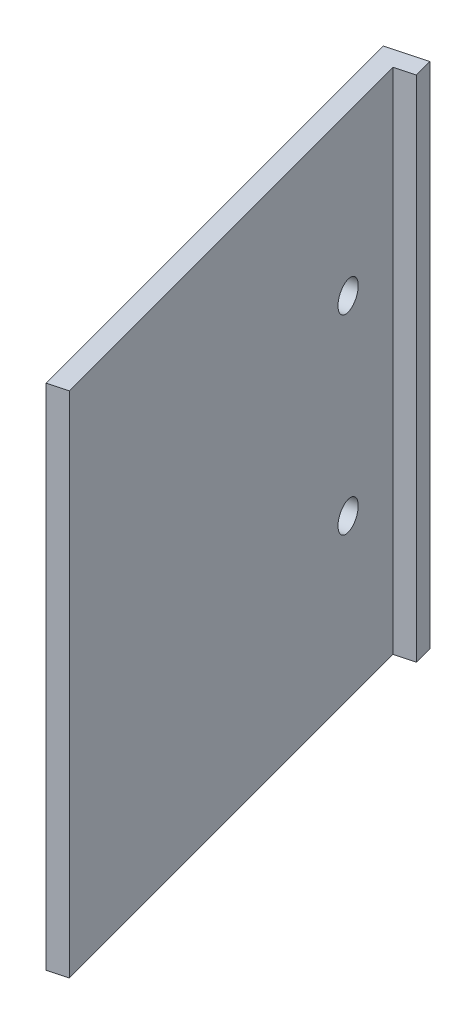
ISO-10303-21;
HEADER;
FILE_DESCRIPTION(('STEP AP214'),'2;1');
FILE_NAME('part.step','',(''),(''),'','','');
FILE_SCHEMA(('AUTOMOTIVE_DESIGN { 1 0 10303 214 1 1 1 1 }'));
ENDSEC;
DATA;
#1=APPLICATION_CONTEXT('core data for automotive mechanical design processes');
#2=APPLICATION_PROTOCOL_DEFINITION('international standard','automotive_design',2000,#1);
#3=PRODUCT_CONTEXT('',#1,'mechanical');
#4=PRODUCT('Part','Part','',(#3));
#5=PRODUCT_RELATED_PRODUCT_CATEGORY('part','',(#4));
#6=PRODUCT_DEFINITION_FORMATION('','',#4);
#7=PRODUCT_DEFINITION_CONTEXT('part definition',#1,'design');
#8=PRODUCT_DEFINITION('design','',#6,#7);
#9=PRODUCT_DEFINITION_SHAPE('','',#8);
#10=(LENGTH_UNIT() NAMED_UNIT(*) SI_UNIT(.MILLI.,.METRE.));
#11=(NAMED_UNIT(*) PLANE_ANGLE_UNIT() SI_UNIT($,.RADIAN.));
#12=(NAMED_UNIT(*) SI_UNIT($,.STERADIAN.) SOLID_ANGLE_UNIT());
#13=UNCERTAINTY_MEASURE_WITH_UNIT(LENGTH_MEASURE(1.E-05),#10,'distance_accuracy_value','');
#14=(GEOMETRIC_REPRESENTATION_CONTEXT(3) GLOBAL_UNCERTAINTY_ASSIGNED_CONTEXT((#13)) GLOBAL_UNIT_ASSIGNED_CONTEXT((#10,
#11,#12)) REPRESENTATION_CONTEXT('',''));
#15=CARTESIAN_POINT('',(0.,0.,0.));
#16=DIRECTION('',(0.,0.,1.));
#17=DIRECTION('',(1.,0.,0.));
#18=AXIS2_PLACEMENT_3D('',#15,#16,#17);
#19=CARTESIAN_POINT('',(-1043.099059252,1824.,2822.933131666));
#20=DIRECTION('',(-0.965925826288944,0.,0.258819045102985));
#21=DIRECTION('',(0.,1.,0.));
#22=AXIS2_PLACEMENT_3D('',#19,#20,#21);
#23=CYLINDRICAL_SURFACE('',#22,4.5);
#24=CARTESIAN_POINT('',(-1043.00246667,1824.,2822.907249761));
#25=DIRECTION('',(-0.965925826288944,0.,0.258819045102985));
#26=DIRECTION('',(0.,1.,0.));
#27=AXIS2_PLACEMENT_3D('',#24,#25,#26);
#28=CIRCLE('',#27,4.5);
#29=CARTESIAN_POINT('',(-1043.00246667,1828.5,2822.907249761));
#30=VERTEX_POINT('',#29);
#31=EDGE_CURVE('E130',#30,#30,#28,.T.);
#32=ORIENTED_EDGE('',*,*,#31,.T.);
#33=DIRECTION('',(0.965925826288944,0.,-0.258819045102985));
#34=VECTOR('',#33,1.);
#35=CARTESIAN_POINT('',(-1043.099059252,1828.5,2822.933131666));
#36=LINE('',#35,#34);
#37=CARTESIAN_POINT('',(-1037.206911712,1828.5,2821.354335491));
#38=VERTEX_POINT('',#37);
#39=EDGE_CURVE('E11',#30,#38,#36,.T.);
#40=ORIENTED_EDGE('',*,*,#39,.T.);
#41=CARTESIAN_POINT('',(-1037.206911712,1824.,2821.354335491));
#42=DIRECTION('',(-0.965925826288944,0.,0.258819045102985));
#43=DIRECTION('',(0.,1.,0.));
#44=AXIS2_PLACEMENT_3D('',#41,#42,#43);
#45=CIRCLE('',#44,4.5);
#46=EDGE_CURVE('E144',#38,#38,#45,.T.);
#47=ORIENTED_EDGE('',*,*,#46,.F.);
#48=ORIENTED_EDGE('',*,*,#39,.F.);
#49=EDGE_LOOP('',(#32,#40,#47,#48));
#50=FACE_BOUND('',#49,.T.);
#51=ADVANCED_FACE('F17',(#50),#23,.F.);
#52=CARTESIAN_POINT('',(-1043.099059252,1764.,2822.933131666));
#53=DIRECTION('',(-0.965925826288944,0.,0.258819045102985));
#54=DIRECTION('',(0.,1.,0.));
#55=AXIS2_PLACEMENT_3D('',#52,#53,#54);
#56=CYLINDRICAL_SURFACE('',#55,4.5);
#57=CARTESIAN_POINT('',(-1043.00246667,1764.,2822.907249761));
#58=DIRECTION('',(-0.965925826288944,0.,0.258819045102985));
#59=DIRECTION('',(0.,1.,0.));
#60=AXIS2_PLACEMENT_3D('',#57,#58,#59);
#61=CIRCLE('',#60,4.5);
#62=CARTESIAN_POINT('',(-1043.00246667,1768.5,2822.907249761));
#63=VERTEX_POINT('',#62);
#64=EDGE_CURVE('E102',#63,#63,#61,.T.);
#65=ORIENTED_EDGE('',*,*,#64,.T.);
#66=DIRECTION('',(0.965925826288944,0.,-0.258819045102985));
#67=VECTOR('',#66,1.);
#68=CARTESIAN_POINT('',(-1043.099059252,1768.5,2822.933131666));
#69=LINE('',#68,#67);
#70=CARTESIAN_POINT('',(-1037.206911712,1768.5,2821.354335491));
#71=VERTEX_POINT('',#70);
#72=EDGE_CURVE('E26',#63,#71,#69,.T.);
#73=ORIENTED_EDGE('',*,*,#72,.T.);
#74=CARTESIAN_POINT('',(-1037.206911712,1764.,2821.354335491));
#75=DIRECTION('',(-0.965925826288944,0.,0.258819045102985));
#76=DIRECTION('',(0.,1.,0.));
#77=AXIS2_PLACEMENT_3D('',#74,#75,#76);
#78=CIRCLE('',#77,4.5);
#79=EDGE_CURVE('E138',#71,#71,#78,.T.);
#80=ORIENTED_EDGE('',*,*,#79,.F.);
#81=ORIENTED_EDGE('',*,*,#72,.F.);
#82=EDGE_LOOP('',(#65,#73,#80,#81));
#83=FACE_BOUND('',#82,.T.);
#84=ADVANCED_FACE('F19',(#83),#56,.F.);
#85=CARTESIAN_POINT('',(-1043.936206885,1874.,2796.240264007));
#86=DIRECTION('',(0.,1.,0.));
#87=DIRECTION('',(1.,0.,0.));
#88=AXIS2_PLACEMENT_3D('',#85,#86,#87);
#89=PLANE('',#88);
#90=DIRECTION('',(0.258819045102985,0.,0.965925826288944));
#91=VECTOR('',#90,1.);
#92=CARTESIAN_POINT('',(-1043.936206885,1874.,2796.240264007));
#93=LINE('',#92,#91);
#94=CARTESIAN_POINT('',(-1042.383292614,1874.,2802.035818965));
#95=VERTEX_POINT('',#94);
#96=CARTESIAN_POINT('',(-1005.113350119,1874.,2941.12913795));
#97=VERTEX_POINT('',#96);
#98=EDGE_CURVE('E181',#95,#97,#93,.T.);
#99=ORIENTED_EDGE('',*,*,#98,.F.);
#100=DIRECTION('',(-0.965925826288944,0.,0.258819045102985));
#101=VECTOR('',#100,1.);
#102=CARTESIAN_POINT('',(-1036.587737656,1874.,2800.482904694));
#103=LINE('',#102,#101);
#104=CARTESIAN_POINT('',(-1036.587737656,1874.,2800.482904694));
#105=VERTEX_POINT('',#104);
#106=EDGE_CURVE('E158',#105,#95,#103,.T.);
#107=ORIENTED_EDGE('',*,*,#106,.F.);
#108=DIRECTION('',(0.258819045102985,0.,0.965925826288944));
#109=VECTOR('',#108,1.);
#110=CARTESIAN_POINT('',(-1038.140651927,1874.,2794.687349737));
#111=LINE('',#110,#109);
#112=CARTESIAN_POINT('',(-1038.140651927,1874.,2794.687349737));
#113=VERTEX_POINT('',#112);
#114=EDGE_CURVE('E109',#113,#105,#111,.T.);
#115=ORIENTED_EDGE('',*,*,#114,.F.);
#116=DIRECTION('',(0.965925826288944,0.,-0.258819045102985));
#117=VECTOR('',#116,1.);
#118=CARTESIAN_POINT('',(-1049.731761842,1874.,2797.793178278));
#119=LINE('',#118,#117);
#120=CARTESIAN_POINT('',(-1049.731761842,1874.,2797.793178278));
#121=VERTEX_POINT('',#120);
#122=EDGE_CURVE('E105',#121,#113,#119,.T.);
#123=ORIENTED_EDGE('',*,*,#122,.F.);
#124=DIRECTION('',(0.258819045102985,0.,0.965925826288944));
#125=VECTOR('',#124,1.);
#126=CARTESIAN_POINT('',(-1049.731761842,1874.,2797.793178278));
#127=LINE('',#126,#125);
#128=CARTESIAN_POINT('',(-1010.908905077,1874.,2942.682052221));
#129=VERTEX_POINT('',#128);
#130=EDGE_CURVE('E91',#121,#129,#127,.T.);
#131=ORIENTED_EDGE('',*,*,#130,.T.);
#132=DIRECTION('',(-0.965925826288944,0.,0.258819045102985));
#133=VECTOR('',#132,1.);
#134=CARTESIAN_POINT('',(-1005.113350119,1874.,2941.12913795));
#135=LINE('',#134,#133);
#136=EDGE_CURVE('E133',#97,#129,#135,.T.);
#137=ORIENTED_EDGE('',*,*,#136,.F.);
#138=EDGE_LOOP('',(#99,#107,#115,#123,#131,#137));
#139=FACE_BOUND('',#138,.T.);
#140=ADVANCED_FACE('F107',(#139),#89,.T.);
#141=CARTESIAN_POINT('',(-1005.113350119,1714.,2941.12913795));
#142=DIRECTION('',(0.258819045102985,0.,0.965925826288944));
#143=DIRECTION('',(0.,-1.,0.));
#144=AXIS2_PLACEMENT_3D('',#141,#142,#143);
#145=PLANE('',#144);
#146=DIRECTION('',(-0.965925826288944,0.,0.258819045102985));
#147=VECTOR('',#146,1.);
#148=CARTESIAN_POINT('',(-1005.113350119,1714.,2941.12913795));
#149=LINE('',#148,#147);
#150=CARTESIAN_POINT('',(-1005.113350119,1714.,2941.12913795));
#151=VERTEX_POINT('',#150);
#152=CARTESIAN_POINT('',(-1010.908905077,1714.,2942.682052221));
#153=VERTEX_POINT('',#152);
#154=EDGE_CURVE('E174',#151,#153,#149,.T.);
#155=ORIENTED_EDGE('',*,*,#154,.F.);
#156=DIRECTION('',(0.,1.,0.));
#157=VECTOR('',#156,1.);
#158=CARTESIAN_POINT('',(-1005.113350119,1714.,2941.12913795));
#159=LINE('',#158,#157);
#160=EDGE_CURVE('E155',#151,#97,#159,.T.);
#161=ORIENTED_EDGE('',*,*,#160,.T.);
#162=ORIENTED_EDGE('',*,*,#136,.T.);
#163=DIRECTION('',(0.,1.,0.));
#164=VECTOR('',#163,1.);
#165=CARTESIAN_POINT('',(-1010.908905077,1714.,2942.682052221));
#166=LINE('',#165,#164);
#167=EDGE_CURVE('E99',#153,#129,#166,.T.);
#168=ORIENTED_EDGE('',*,*,#167,.F.);
#169=EDGE_LOOP('',(#155,#161,#162,#168));
#170=FACE_BOUND('',#169,.T.);
#171=ADVANCED_FACE('F213',(#170),#145,.T.);
#172=CARTESIAN_POINT('',(-1049.731761842,1714.,2797.793178278));
#173=DIRECTION('',(-0.965925826288944,0.,0.258819045102985));
#174=DIRECTION('',(0.,1.,0.));
#175=AXIS2_PLACEMENT_3D('',#172,#173,#174);
#176=PLANE('',#175);
#177=ORIENTED_EDGE('',*,*,#31,.F.);
#178=EDGE_LOOP('',(#177));
#179=FACE_BOUND('',#178,.T.);
#180=ORIENTED_EDGE('',*,*,#64,.F.);
#181=EDGE_LOOP('',(#180));
#182=FACE_BOUND('',#181,.T.);
#183=DIRECTION('',(0.,1.,0.));
#184=VECTOR('',#183,1.);
#185=CARTESIAN_POINT('',(-1049.731761842,1714.,2797.793178278));
#186=LINE('',#185,#184);
#187=CARTESIAN_POINT('',(-1049.731761842,1714.,2797.793178278));
#188=VERTEX_POINT('',#187);
#189=EDGE_CURVE('E96',#188,#121,#186,.T.);
#190=ORIENTED_EDGE('',*,*,#189,.F.);
#191=DIRECTION('',(0.258819045102985,0.,0.965925826288944));
#192=VECTOR('',#191,1.);
#193=CARTESIAN_POINT('',(-1049.731761842,1714.,2797.793178278));
#194=LINE('',#193,#192);
#195=EDGE_CURVE('E177',#188,#153,#194,.T.);
#196=ORIENTED_EDGE('',*,*,#195,.T.);
#197=ORIENTED_EDGE('',*,*,#167,.T.);
#198=ORIENTED_EDGE('',*,*,#130,.F.);
#199=EDGE_LOOP('',(#190,#196,#197,#198));
#200=FACE_BOUND('',#199,.T.);
#201=ADVANCED_FACE('F93',(#179,#182,#200),#176,.T.);
#202=CARTESIAN_POINT('',(-1043.936206885,1714.,2796.240264007));
#203=DIRECTION('',(0.258819045102985,0.,0.965925826288944));
#204=DIRECTION('',(0.,-1.,0.));
#205=AXIS2_PLACEMENT_3D('',#202,#203,#204);
#206=PLANE('',#205);
#207=ORIENTED_EDGE('',*,*,#189,.T.);
#208=ORIENTED_EDGE('',*,*,#122,.T.);
#209=DIRECTION('',(0.,1.,0.));
#210=VECTOR('',#209,1.);
#211=CARTESIAN_POINT('',(-1038.140651927,1714.,2794.687349737));
#212=LINE('',#211,#210);
#213=CARTESIAN_POINT('',(-1038.140651927,1714.,2794.687349737));
#214=VERTEX_POINT('',#213);
#215=EDGE_CURVE('E119',#214,#113,#212,.T.);
#216=ORIENTED_EDGE('',*,*,#215,.F.);
#217=DIRECTION('',(0.965925826288944,0.,-0.258819045102985));
#218=VECTOR('',#217,1.);
#219=CARTESIAN_POINT('',(-1049.731761842,1714.,2797.793178278));
#220=LINE('',#219,#218);
#221=EDGE_CURVE('E116',#188,#214,#220,.T.);
#222=ORIENTED_EDGE('',*,*,#221,.F.);
#223=EDGE_LOOP('',(#207,#208,#216,#222));
#224=FACE_BOUND('',#223,.T.);
#225=ADVANCED_FACE('F114',(#224),#206,.F.);
#226=CARTESIAN_POINT('',(-1038.140651927,1714.,2794.687349737));
#227=DIRECTION('',(-0.965925826288944,0.,0.258819045102985));
#228=DIRECTION('',(0.,1.,0.));
#229=AXIS2_PLACEMENT_3D('',#226,#227,#228);
#230=PLANE('',#229);
#231=ORIENTED_EDGE('',*,*,#114,.T.);
#232=DIRECTION('',(0.,1.,0.));
#233=VECTOR('',#232,1.);
#234=CARTESIAN_POINT('',(-1036.587737656,1714.,2800.482904694));
#235=LINE('',#234,#233);
#236=CARTESIAN_POINT('',(-1036.587737656,1714.,2800.482904694));
#237=VERTEX_POINT('',#236);
#238=EDGE_CURVE('E151',#237,#105,#235,.T.);
#239=ORIENTED_EDGE('',*,*,#238,.F.);
#240=DIRECTION('',(0.258819045102985,0.,0.965925826288944));
#241=VECTOR('',#240,1.);
#242=CARTESIAN_POINT('',(-1038.140651927,1714.,2794.687349737));
#243=LINE('',#242,#241);
#244=EDGE_CURVE('E176',#214,#237,#243,.T.);
#245=ORIENTED_EDGE('',*,*,#244,.F.);
#246=ORIENTED_EDGE('',*,*,#215,.T.);
#247=EDGE_LOOP('',(#231,#239,#245,#246));
#248=FACE_BOUND('',#247,.T.);
#249=ADVANCED_FACE('F244',(#248),#230,.F.);
#250=CARTESIAN_POINT('',(-1036.587737656,1714.,2800.482904694));
#251=DIRECTION('',(0.258819045102985,0.,0.965925826288944));
#252=DIRECTION('',(0.,-1.,0.));
#253=AXIS2_PLACEMENT_3D('',#250,#251,#252);
#254=PLANE('',#253);
#255=DIRECTION('',(-0.965925826288944,0.,0.258819045102985));
#256=VECTOR('',#255,1.);
#257=CARTESIAN_POINT('',(-1036.587737656,1714.,2800.482904694));
#258=LINE('',#257,#256);
#259=CARTESIAN_POINT('',(-1042.383292614,1714.,2802.035818965));
#260=VERTEX_POINT('',#259);
#261=EDGE_CURVE('E191',#237,#260,#258,.T.);
#262=ORIENTED_EDGE('',*,*,#261,.F.);
#263=ORIENTED_EDGE('',*,*,#238,.T.);
#264=ORIENTED_EDGE('',*,*,#106,.T.);
#265=DIRECTION('',(0.,1.,0.));
#266=VECTOR('',#265,1.);
#267=CARTESIAN_POINT('',(-1042.383292614,1714.,2802.035818965));
#268=LINE('',#267,#266);
#269=EDGE_CURVE('E145',#260,#95,#268,.T.);
#270=ORIENTED_EDGE('',*,*,#269,.F.);
#271=EDGE_LOOP('',(#262,#263,#264,#270));
#272=FACE_BOUND('',#271,.T.);
#273=ADVANCED_FACE('F207',(#272),#254,.T.);
#274=CARTESIAN_POINT('',(-1043.936206885,1714.,2796.240264007));
#275=DIRECTION('',(-0.965925826288944,0.,0.258819045102985));
#276=DIRECTION('',(0.,1.,0.));
#277=AXIS2_PLACEMENT_3D('',#274,#275,#276);
#278=PLANE('',#277);
#279=ORIENTED_EDGE('',*,*,#46,.T.);
#280=EDGE_LOOP('',(#279));
#281=FACE_BOUND('',#280,.T.);
#282=ORIENTED_EDGE('',*,*,#79,.T.);
#283=EDGE_LOOP('',(#282));
#284=FACE_BOUND('',#283,.T.);
#285=ORIENTED_EDGE('',*,*,#98,.T.);
#286=ORIENTED_EDGE('',*,*,#160,.F.);
#287=DIRECTION('',(0.258819045102985,0.,0.965925826288944));
#288=VECTOR('',#287,1.);
#289=CARTESIAN_POINT('',(-1043.936206885,1714.,2796.240264007));
#290=LINE('',#289,#288);
#291=EDGE_CURVE('E184',#260,#151,#290,.T.);
#292=ORIENTED_EDGE('',*,*,#291,.F.);
#293=ORIENTED_EDGE('',*,*,#269,.T.);
#294=EDGE_LOOP('',(#285,#286,#292,#293));
#295=FACE_BOUND('',#294,.T.);
#296=ADVANCED_FACE('F141',(#281,#284,#295),#278,.F.);
#297=CARTESIAN_POINT('',(-1043.936206885,1714.,2796.240264007));
#298=DIRECTION('',(0.,1.,0.));
#299=DIRECTION('',(1.,0.,0.));
#300=AXIS2_PLACEMENT_3D('',#297,#298,#299);
#301=PLANE('',#300);
#302=ORIENTED_EDGE('',*,*,#154,.T.);
#303=ORIENTED_EDGE('',*,*,#195,.F.);
#304=ORIENTED_EDGE('',*,*,#221,.T.);
#305=ORIENTED_EDGE('',*,*,#244,.T.);
#306=ORIENTED_EDGE('',*,*,#261,.T.);
#307=ORIENTED_EDGE('',*,*,#291,.T.);
#308=EDGE_LOOP('',(#302,#303,#304,#305,#306,#307));
#309=FACE_BOUND('',#308,.T.);
#310=ADVANCED_FACE('F200',(#309),#301,.F.);
#311=CLOSED_SHELL('',(#51,#84,#140,#171,#201,#225,#249,#273,#296,#310));
#312=MANIFOLD_SOLID_BREP('B1',#311);
#313=ADVANCED_BREP_SHAPE_REPRESENTATION('',(#18,#312),#14);
#314=SHAPE_DEFINITION_REPRESENTATION(#9,#313);
ENDSEC;
END-ISO-10303-21;
